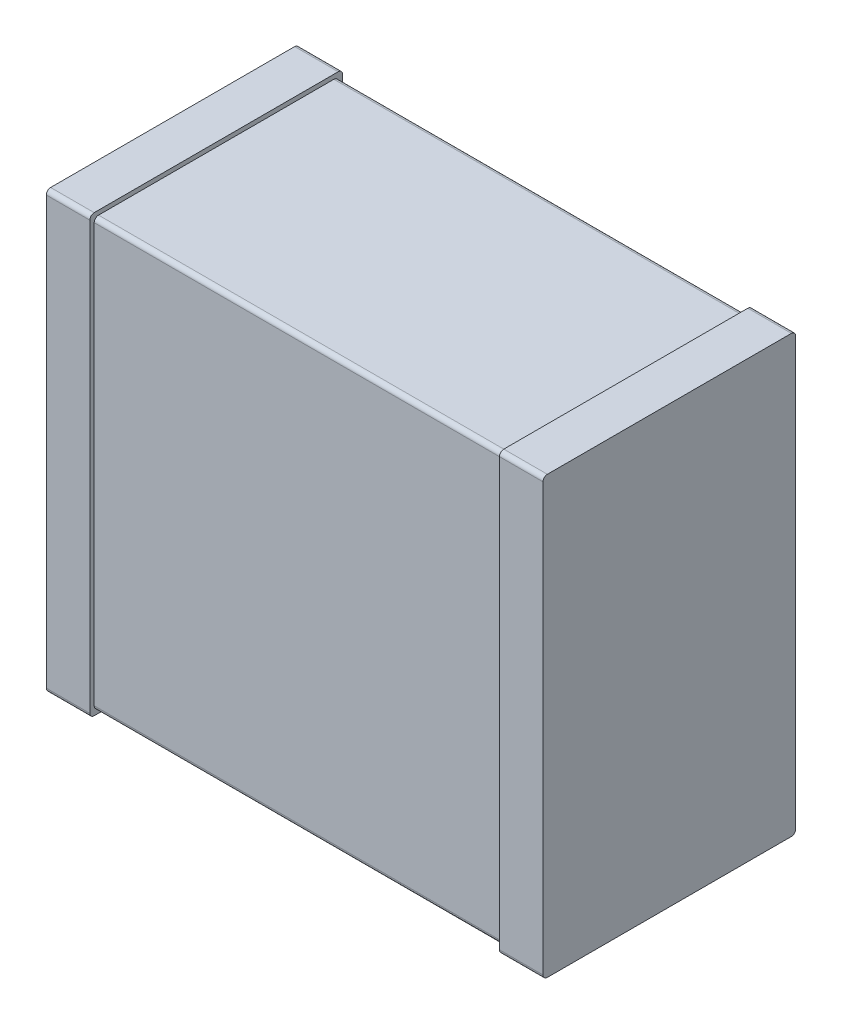
ISO-10303-21;
HEADER;
FILE_DESCRIPTION(('STEP AP214'),'2;1');
FILE_NAME('part.step','',(''),(''),'','','');
FILE_SCHEMA(('AUTOMOTIVE_DESIGN { 1 0 10303 214 1 1 1 1 }'));
ENDSEC;
DATA;
#1=APPLICATION_CONTEXT('core data for automotive mechanical design processes');
#2=APPLICATION_PROTOCOL_DEFINITION('international standard','automotive_design',2000,#1);
#3=PRODUCT_CONTEXT('',#1,'mechanical');
#4=PRODUCT('Part','Part','',(#3));
#5=PRODUCT_RELATED_PRODUCT_CATEGORY('part','',(#4));
#6=PRODUCT_DEFINITION_FORMATION('','',#4);
#7=PRODUCT_DEFINITION_CONTEXT('part definition',#1,'design');
#8=PRODUCT_DEFINITION('design','',#6,#7);
#9=PRODUCT_DEFINITION_SHAPE('','',#8);
#10=(LENGTH_UNIT() NAMED_UNIT(*) SI_UNIT(.MILLI.,.METRE.));
#11=(NAMED_UNIT(*) PLANE_ANGLE_UNIT() SI_UNIT($,.RADIAN.));
#12=(NAMED_UNIT(*) SI_UNIT($,.STERADIAN.) SOLID_ANGLE_UNIT());
#13=UNCERTAINTY_MEASURE_WITH_UNIT(LENGTH_MEASURE(1.E-05),#10,'distance_accuracy_value','');
#14=(GEOMETRIC_REPRESENTATION_CONTEXT(3) GLOBAL_UNCERTAINTY_ASSIGNED_CONTEXT((#13)) GLOBAL_UNIT_ASSIGNED_CONTEXT((#10,
#11,#12)) REPRESENTATION_CONTEXT('',''));
#15=CARTESIAN_POINT('',(0.,0.,0.));
#16=DIRECTION('',(0.,0.,1.));
#17=DIRECTION('',(1.,0.,0.));
#18=AXIS2_PLACEMENT_3D('',#15,#16,#17);
#19=CARTESIAN_POINT('',(-2.85,-2.5,0.));
#20=DIRECTION('',(1.,0.,0.));
#21=DIRECTION('',(0.,1.,0.));
#22=AXIS2_PLACEMENT_3D('',#19,#20,#21);
#23=PLANE('',#22);
#24=CARTESIAN_POINT('',(-2.85,-2.45,2.85));
#25=DIRECTION('',(-1.,0.,0.));
#26=DIRECTION('',(0.,0.,1.));
#27=AXIS2_PLACEMENT_3D('',#24,#25,#26);
#28=CIRCLE('',#27,0.05);
#29=CARTESIAN_POINT('',(-2.85,-2.5,2.85));
#30=VERTEX_POINT('',#29);
#31=CARTESIAN_POINT('',(-2.85,-2.45,2.9));
#32=VERTEX_POINT('',#31);
#33=EDGE_CURVE('E323',#30,#32,#28,.T.);
#34=ORIENTED_EDGE('',*,*,#33,.T.);
#35=DIRECTION('',(0.,1.,0.));
#36=VECTOR('',#35,1.);
#37=CARTESIAN_POINT('',(-2.85,-2.5,2.9));
#38=LINE('',#37,#36);
#39=CARTESIAN_POINT('',(-2.85,2.45,2.9));
#40=VERTEX_POINT('',#39);
#41=EDGE_CURVE('E82',#32,#40,#38,.T.);
#42=ORIENTED_EDGE('',*,*,#41,.T.);
#43=CARTESIAN_POINT('',(-2.85,2.45,2.85));
#44=DIRECTION('',(1.,0.,0.));
#45=DIRECTION('',(0.,0.,1.));
#46=AXIS2_PLACEMENT_3D('',#43,#44,#45);
#47=CIRCLE('',#46,0.05);
#48=CARTESIAN_POINT('',(-2.85,2.5,2.85));
#49=VERTEX_POINT('',#48);
#50=EDGE_CURVE('E240',#49,#40,#47,.T.);
#51=ORIENTED_EDGE('',*,*,#50,.F.);
#52=DIRECTION('',(0.,0.,1.));
#53=VECTOR('',#52,1.);
#54=CARTESIAN_POINT('',(-2.85,2.5,0.));
#55=LINE('',#54,#53);
#56=CARTESIAN_POINT('',(-2.85,2.5,0.05));
#57=VERTEX_POINT('',#56);
#58=EDGE_CURVE('E11',#57,#49,#55,.T.);
#59=ORIENTED_EDGE('',*,*,#58,.F.);
#60=CARTESIAN_POINT('',(-2.85,2.45,0.05));
#61=DIRECTION('',(-1.,0.,0.));
#62=DIRECTION('',(0.,0.,1.));
#63=AXIS2_PLACEMENT_3D('',#60,#61,#62);
#64=CIRCLE('',#63,0.05);
#65=CARTESIAN_POINT('',(-2.85,2.45,0.));
#66=VERTEX_POINT('',#65);
#67=EDGE_CURVE('E335',#57,#66,#64,.T.);
#68=ORIENTED_EDGE('',*,*,#67,.T.);
#69=DIRECTION('',(0.,1.,0.));
#70=VECTOR('',#69,1.);
#71=CARTESIAN_POINT('',(-2.85,-2.5,0.));
#72=LINE('',#71,#70);
#73=CARTESIAN_POINT('',(-2.85,-2.45,0.));
#74=VERTEX_POINT('',#73);
#75=EDGE_CURVE('E71',#74,#66,#72,.T.);
#76=ORIENTED_EDGE('',*,*,#75,.F.);
#77=CARTESIAN_POINT('',(-2.85,-2.45,0.05));
#78=DIRECTION('',(1.,0.,0.));
#79=DIRECTION('',(0.,0.,1.));
#80=AXIS2_PLACEMENT_3D('',#77,#78,#79);
#81=CIRCLE('',#80,0.05);
#82=CARTESIAN_POINT('',(-2.85,-2.5,0.05));
#83=VERTEX_POINT('',#82);
#84=EDGE_CURVE('E313',#83,#74,#81,.T.);
#85=ORIENTED_EDGE('',*,*,#84,.F.);
#86=DIRECTION('',(0.,0.,1.));
#87=VECTOR('',#86,1.);
#88=CARTESIAN_POINT('',(-2.85,-2.5,0.));
#89=LINE('',#88,#87);
#90=EDGE_CURVE('E314',#83,#30,#89,.T.);
#91=ORIENTED_EDGE('',*,*,#90,.T.);
#92=EDGE_LOOP('',(#34,#42,#51,#59,#68,#76,#85,#91));
#93=FACE_BOUND('',#92,.T.);
#94=ADVANCED_FACE('F17',(#93),#23,.F.);
#95=CARTESIAN_POINT('',(-2.85,2.5,0.));
#96=DIRECTION('',(0.,1.,0.));
#97=DIRECTION('',(1.,0.,0.));
#98=AXIS2_PLACEMENT_3D('',#95,#96,#97);
#99=PLANE('',#98);
#100=DIRECTION('',(0.,0.,1.));
#101=VECTOR('',#100,1.);
#102=CARTESIAN_POINT('',(-2.35,2.5,0.));
#103=LINE('',#102,#101);
#104=CARTESIAN_POINT('',(-2.35,2.5,0.05));
#105=VERTEX_POINT('',#104);
#106=CARTESIAN_POINT('',(-2.35,2.5,2.85));
#107=VERTEX_POINT('',#106);
#108=EDGE_CURVE('E258',#105,#107,#103,.T.);
#109=ORIENTED_EDGE('',*,*,#108,.F.);
#110=DIRECTION('',(1.,0.,0.));
#111=VECTOR('',#110,1.);
#112=CARTESIAN_POINT('',(-2.85,2.5,0.05));
#113=LINE('',#112,#111);
#114=EDGE_CURVE('E242',#57,#105,#113,.T.);
#115=ORIENTED_EDGE('',*,*,#114,.F.);
#116=ORIENTED_EDGE('',*,*,#58,.T.);
#117=DIRECTION('',(1.,0.,0.));
#118=VECTOR('',#117,1.);
#119=CARTESIAN_POINT('',(-2.85,2.5,2.85));
#120=LINE('',#119,#118);
#121=EDGE_CURVE('E20',#49,#107,#120,.T.);
#122=ORIENTED_EDGE('',*,*,#121,.T.);
#123=EDGE_LOOP('',(#109,#115,#116,#122));
#124=FACE_BOUND('',#123,.T.);
#125=ADVANCED_FACE('F571',(#124),#99,.T.);
#126=CARTESIAN_POINT('',(-2.85,2.45,2.85));
#127=DIRECTION('',(1.,0.,0.));
#128=DIRECTION('',(0.,1.,0.));
#129=AXIS2_PLACEMENT_3D('',#126,#127,#128);
#130=CYLINDRICAL_SURFACE('',#129,0.05);
#131=ORIENTED_EDGE('',*,*,#50,.T.);
#132=DIRECTION('',(1.,0.,0.));
#133=VECTOR('',#132,1.);
#134=CARTESIAN_POINT('',(-2.85,2.45,2.9));
#135=LINE('',#134,#133);
#136=CARTESIAN_POINT('',(-2.35,2.45,2.9));
#137=VERTEX_POINT('',#136);
#138=EDGE_CURVE('E234',#40,#137,#135,.T.);
#139=ORIENTED_EDGE('',*,*,#138,.T.);
#140=CARTESIAN_POINT('',(-2.35,2.45,2.85));
#141=DIRECTION('',(1.,0.,0.));
#142=DIRECTION('',(0.,0.,1.));
#143=AXIS2_PLACEMENT_3D('',#140,#141,#142);
#144=CIRCLE('',#143,0.05);
#145=EDGE_CURVE('E238',#107,#137,#144,.T.);
#146=ORIENTED_EDGE('',*,*,#145,.F.);
#147=ORIENTED_EDGE('',*,*,#121,.F.);
#148=EDGE_LOOP('',(#131,#139,#146,#147));
#149=FACE_BOUND('',#148,.T.);
#150=ADVANCED_FACE('F236',(#149),#130,.T.);
#151=CARTESIAN_POINT('',(-2.85,2.45,0.05));
#152=DIRECTION('',(1.,0.,0.));
#153=DIRECTION('',(0.,1.,0.));
#154=AXIS2_PLACEMENT_3D('',#151,#152,#153);
#155=CYLINDRICAL_SURFACE('',#154,0.05);
#156=ORIENTED_EDGE('',*,*,#114,.T.);
#157=CARTESIAN_POINT('',(-2.35,2.45,0.05));
#158=DIRECTION('',(-1.,0.,0.));
#159=DIRECTION('',(0.,0.,1.));
#160=AXIS2_PLACEMENT_3D('',#157,#158,#159);
#161=CIRCLE('',#160,0.05);
#162=CARTESIAN_POINT('',(-2.35,2.45,0.));
#163=VERTEX_POINT('',#162);
#164=EDGE_CURVE('E265',#105,#163,#161,.T.);
#165=ORIENTED_EDGE('',*,*,#164,.T.);
#166=DIRECTION('',(1.,0.,0.));
#167=VECTOR('',#166,1.);
#168=CARTESIAN_POINT('',(-2.85,2.45,0.));
#169=LINE('',#168,#167);
#170=EDGE_CURVE('E326',#66,#163,#169,.T.);
#171=ORIENTED_EDGE('',*,*,#170,.F.);
#172=ORIENTED_EDGE('',*,*,#67,.F.);
#173=EDGE_LOOP('',(#156,#165,#171,#172));
#174=FACE_BOUND('',#173,.T.);
#175=ADVANCED_FACE('F555',(#174),#155,.T.);
#176=CARTESIAN_POINT('',(-2.85,-2.5,2.9));
#177=DIRECTION('',(0.,0.,1.));
#178=DIRECTION('',(1.,0.,0.));
#179=AXIS2_PLACEMENT_3D('',#176,#177,#178);
#180=PLANE('',#179);
#181=ORIENTED_EDGE('',*,*,#41,.F.);
#182=DIRECTION('',(1.,0.,0.));
#183=VECTOR('',#182,1.);
#184=CARTESIAN_POINT('',(-2.85,-2.45,2.9));
#185=LINE('',#184,#183);
#186=CARTESIAN_POINT('',(-2.35,-2.45,2.9));
#187=VERTEX_POINT('',#186);
#188=EDGE_CURVE('E248',#32,#187,#185,.T.);
#189=ORIENTED_EDGE('',*,*,#188,.T.);
#190=DIRECTION('',(0.,1.,0.));
#191=VECTOR('',#190,1.);
#192=CARTESIAN_POINT('',(-2.35,-2.5,2.9));
#193=LINE('',#192,#191);
#194=EDGE_CURVE('E245',#187,#137,#193,.T.);
#195=ORIENTED_EDGE('',*,*,#194,.T.);
#196=ORIENTED_EDGE('',*,*,#138,.F.);
#197=EDGE_LOOP('',(#181,#189,#195,#196));
#198=FACE_BOUND('',#197,.T.);
#199=ADVANCED_FACE('F246',(#198),#180,.T.);
#200=CARTESIAN_POINT('',(-2.85,-2.5,0.));
#201=DIRECTION('',(0.,0.,1.));
#202=DIRECTION('',(1.,0.,0.));
#203=AXIS2_PLACEMENT_3D('',#200,#201,#202);
#204=PLANE('',#203);
#205=ORIENTED_EDGE('',*,*,#170,.T.);
#206=DIRECTION('',(0.,1.,0.));
#207=VECTOR('',#206,1.);
#208=CARTESIAN_POINT('',(-2.35,-2.5,0.));
#209=LINE('',#208,#207);
#210=CARTESIAN_POINT('',(-2.35,-2.45,0.));
#211=VERTEX_POINT('',#210);
#212=EDGE_CURVE('E302',#211,#163,#209,.T.);
#213=ORIENTED_EDGE('',*,*,#212,.F.);
#214=DIRECTION('',(1.,0.,0.));
#215=VECTOR('',#214,1.);
#216=CARTESIAN_POINT('',(-2.85,-2.45,0.));
#217=LINE('',#216,#215);
#218=EDGE_CURVE('E318',#74,#211,#217,.T.);
#219=ORIENTED_EDGE('',*,*,#218,.F.);
#220=ORIENTED_EDGE('',*,*,#75,.T.);
#221=EDGE_LOOP('',(#205,#213,#219,#220));
#222=FACE_BOUND('',#221,.T.);
#223=ADVANCED_FACE('F408',(#222),#204,.F.);
#224=CARTESIAN_POINT('',(-2.85,-2.45,2.85));
#225=DIRECTION('',(1.,0.,0.));
#226=DIRECTION('',(0.,-1.,0.));
#227=AXIS2_PLACEMENT_3D('',#224,#225,#226);
#228=CYLINDRICAL_SURFACE('',#227,0.05);
#229=DIRECTION('',(1.,0.,0.));
#230=VECTOR('',#229,1.);
#231=CARTESIAN_POINT('',(-2.85,-2.5,2.85));
#232=LINE('',#231,#230);
#233=CARTESIAN_POINT('',(-2.35,-2.5,2.85));
#234=VERTEX_POINT('',#233);
#235=EDGE_CURVE('E309',#30,#234,#232,.T.);
#236=ORIENTED_EDGE('',*,*,#235,.T.);
#237=CARTESIAN_POINT('',(-2.35,-2.45,2.85));
#238=DIRECTION('',(-1.,0.,0.));
#239=DIRECTION('',(0.,0.,1.));
#240=AXIS2_PLACEMENT_3D('',#237,#238,#239);
#241=CIRCLE('',#240,0.05);
#242=EDGE_CURVE('E253',#234,#187,#241,.T.);
#243=ORIENTED_EDGE('',*,*,#242,.T.);
#244=ORIENTED_EDGE('',*,*,#188,.F.);
#245=ORIENTED_EDGE('',*,*,#33,.F.);
#246=EDGE_LOOP('',(#236,#243,#244,#245));
#247=FACE_BOUND('',#246,.T.);
#248=ADVANCED_FACE('F404',(#247),#228,.T.);
#249=CARTESIAN_POINT('',(-2.85,-2.45,0.05));
#250=DIRECTION('',(1.,0.,0.));
#251=DIRECTION('',(0.,-1.,0.));
#252=AXIS2_PLACEMENT_3D('',#249,#250,#251);
#253=CYLINDRICAL_SURFACE('',#252,0.05);
#254=ORIENTED_EDGE('',*,*,#84,.T.);
#255=ORIENTED_EDGE('',*,*,#218,.T.);
#256=CARTESIAN_POINT('',(-2.35,-2.45,0.05));
#257=DIRECTION('',(1.,0.,0.));
#258=DIRECTION('',(0.,0.,1.));
#259=AXIS2_PLACEMENT_3D('',#256,#257,#258);
#260=CIRCLE('',#259,0.05);
#261=CARTESIAN_POINT('',(-2.35,-2.5,0.05));
#262=VERTEX_POINT('',#261);
#263=EDGE_CURVE('E305',#262,#211,#260,.T.);
#264=ORIENTED_EDGE('',*,*,#263,.F.);
#265=DIRECTION('',(1.,0.,0.));
#266=VECTOR('',#265,1.);
#267=CARTESIAN_POINT('',(-2.85,-2.5,0.05));
#268=LINE('',#267,#266);
#269=EDGE_CURVE('E310',#83,#262,#268,.T.);
#270=ORIENTED_EDGE('',*,*,#269,.F.);
#271=EDGE_LOOP('',(#254,#255,#264,#270));
#272=FACE_BOUND('',#271,.T.);
#273=ADVANCED_FACE('F349',(#272),#253,.T.);
#274=CARTESIAN_POINT('',(-2.85,-2.5,0.));
#275=DIRECTION('',(0.,1.,0.));
#276=DIRECTION('',(1.,0.,0.));
#277=AXIS2_PLACEMENT_3D('',#274,#275,#276);
#278=PLANE('',#277);
#279=ORIENTED_EDGE('',*,*,#235,.F.);
#280=ORIENTED_EDGE('',*,*,#90,.F.);
#281=ORIENTED_EDGE('',*,*,#269,.T.);
#282=DIRECTION('',(0.,0.,1.));
#283=VECTOR('',#282,1.);
#284=CARTESIAN_POINT('',(-2.35,-2.5,0.));
#285=LINE('',#284,#283);
#286=EDGE_CURVE('E299',#262,#234,#285,.T.);
#287=ORIENTED_EDGE('',*,*,#286,.T.);
#288=EDGE_LOOP('',(#279,#280,#281,#287));
#289=FACE_BOUND('',#288,.T.);
#290=ADVANCED_FACE('F344',(#289),#278,.F.);
#291=CARTESIAN_POINT('',(-2.35,-2.5,0.));
#292=DIRECTION('',(1.,0.,0.));
#293=DIRECTION('',(0.,1.,0.));
#294=AXIS2_PLACEMENT_3D('',#291,#292,#293);
#295=PLANE('',#294);
#296=CARTESIAN_POINT('',(-2.35,-2.4,0.1));
#297=DIRECTION('',(1.,0.,0.));
#298=DIRECTION('',(0.,0.,1.));
#299=AXIS2_PLACEMENT_3D('',#296,#297,#298);
#300=CIRCLE('',#299,0.05);
#301=CARTESIAN_POINT('',(-2.35,-2.45,0.1));
#302=VERTEX_POINT('',#301);
#303=CARTESIAN_POINT('',(-2.35,-2.4,0.05));
#304=VERTEX_POINT('',#303);
#305=EDGE_CURVE('E723',#302,#304,#300,.T.);
#306=ORIENTED_EDGE('',*,*,#305,.F.);
#307=DIRECTION('',(0.,0.,1.));
#308=VECTOR('',#307,1.);
#309=CARTESIAN_POINT('',(-2.35,-2.45,0.05));
#310=LINE('',#309,#308);
#311=CARTESIAN_POINT('',(-2.35,-2.45,2.8));
#312=VERTEX_POINT('',#311);
#313=EDGE_CURVE('E296',#302,#312,#310,.T.);
#314=ORIENTED_EDGE('',*,*,#313,.T.);
#315=CARTESIAN_POINT('',(-2.35,-2.4,2.8));
#316=DIRECTION('',(-1.,0.,0.));
#317=DIRECTION('',(0.,0.,1.));
#318=AXIS2_PLACEMENT_3D('',#315,#316,#317);
#319=CIRCLE('',#318,0.05);
#320=CARTESIAN_POINT('',(-2.35,-2.4,2.85));
#321=VERTEX_POINT('',#320);
#322=EDGE_CURVE('E295',#312,#321,#319,.T.);
#323=ORIENTED_EDGE('',*,*,#322,.T.);
#324=DIRECTION('',(0.,1.,0.));
#325=VECTOR('',#324,1.);
#326=CARTESIAN_POINT('',(-2.35,-2.45,2.85));
#327=LINE('',#326,#325);
#328=CARTESIAN_POINT('',(-2.35,2.4,2.85));
#329=VERTEX_POINT('',#328);
#330=EDGE_CURVE('E288',#321,#329,#327,.T.);
#331=ORIENTED_EDGE('',*,*,#330,.T.);
#332=CARTESIAN_POINT('',(-2.35,2.4,2.8));
#333=DIRECTION('',(1.,0.,0.));
#334=DIRECTION('',(0.,0.,1.));
#335=AXIS2_PLACEMENT_3D('',#332,#333,#334);
#336=CIRCLE('',#335,0.05);
#337=CARTESIAN_POINT('',(-2.35,2.45,2.8));
#338=VERTEX_POINT('',#337);
#339=EDGE_CURVE('E281',#338,#329,#336,.T.);
#340=ORIENTED_EDGE('',*,*,#339,.F.);
#341=DIRECTION('',(0.,0.,1.));
#342=VECTOR('',#341,1.);
#343=CARTESIAN_POINT('',(-2.35,2.45,0.05));
#344=LINE('',#343,#342);
#345=CARTESIAN_POINT('',(-2.35,2.45,0.1));
#346=VERTEX_POINT('',#345);
#347=EDGE_CURVE('E273',#346,#338,#344,.T.);
#348=ORIENTED_EDGE('',*,*,#347,.F.);
#349=CARTESIAN_POINT('',(-2.35,2.4,0.1));
#350=DIRECTION('',(-1.,0.,0.));
#351=DIRECTION('',(0.,0.,1.));
#352=AXIS2_PLACEMENT_3D('',#349,#350,#351);
#353=CIRCLE('',#352,0.05);
#354=CARTESIAN_POINT('',(-2.35,2.4,0.05));
#355=VERTEX_POINT('',#354);
#356=EDGE_CURVE('E271',#346,#355,#353,.T.);
#357=ORIENTED_EDGE('',*,*,#356,.T.);
#358=DIRECTION('',(0.,1.,0.));
#359=VECTOR('',#358,1.);
#360=CARTESIAN_POINT('',(-2.35,-2.45,0.05));
#361=LINE('',#360,#359);
#362=EDGE_CURVE('E698',#304,#355,#361,.T.);
#363=ORIENTED_EDGE('',*,*,#362,.F.);
#364=EDGE_LOOP('',(#306,#314,#323,#331,#340,#348,#357,#363));
#365=FACE_BOUND('',#364,.T.);
#366=ORIENTED_EDGE('',*,*,#286,.F.);
#367=ORIENTED_EDGE('',*,*,#263,.T.);
#368=ORIENTED_EDGE('',*,*,#212,.T.);
#369=ORIENTED_EDGE('',*,*,#164,.F.);
#370=ORIENTED_EDGE('',*,*,#108,.T.);
#371=ORIENTED_EDGE('',*,*,#145,.T.);
#372=ORIENTED_EDGE('',*,*,#194,.F.);
#373=ORIENTED_EDGE('',*,*,#242,.F.);
#374=EDGE_LOOP('',(#366,#367,#368,#369,#370,#371,#372,#373));
#375=FACE_BOUND('',#374,.T.);
#376=ADVANCED_FACE('F256',(#365,#375),#295,.T.);
#377=CARTESIAN_POINT('',(2.85,-2.5,0.));
#378=DIRECTION('',(1.,0.,0.));
#379=DIRECTION('',(0.,1.,0.));
#380=AXIS2_PLACEMENT_3D('',#377,#378,#379);
#381=PLANE('',#380);
#382=DIRECTION('',(0.,0.,1.));
#383=VECTOR('',#382,1.);
#384=CARTESIAN_POINT('',(2.85,-2.5,0.));
#385=LINE('',#384,#383);
#386=CARTESIAN_POINT('',(2.85,-2.5,0.05));
#387=VERTEX_POINT('',#386);
#388=CARTESIAN_POINT('',(2.85,-2.5,2.85));
#389=VERTEX_POINT('',#388);
#390=EDGE_CURVE('E677',#387,#389,#385,.T.);
#391=ORIENTED_EDGE('',*,*,#390,.F.);
#392=CARTESIAN_POINT('',(2.85,-2.45,0.05));
#393=DIRECTION('',(1.,0.,0.));
#394=DIRECTION('',(0.,0.,1.));
#395=AXIS2_PLACEMENT_3D('',#392,#393,#394);
#396=CIRCLE('',#395,0.05);
#397=CARTESIAN_POINT('',(2.85,-2.45,0.));
#398=VERTEX_POINT('',#397);
#399=EDGE_CURVE('E685',#387,#398,#396,.T.);
#400=ORIENTED_EDGE('',*,*,#399,.T.);
#401=DIRECTION('',(0.,1.,0.));
#402=VECTOR('',#401,1.);
#403=CARTESIAN_POINT('',(2.85,-2.5,0.));
#404=LINE('',#403,#402);
#405=CARTESIAN_POINT('',(2.85,2.45,0.));
#406=VERTEX_POINT('',#405);
#407=EDGE_CURVE('E607',#398,#406,#404,.T.);
#408=ORIENTED_EDGE('',*,*,#407,.T.);
#409=CARTESIAN_POINT('',(2.85,2.45,0.05));
#410=DIRECTION('',(-1.,0.,0.));
#411=DIRECTION('',(0.,0.,1.));
#412=AXIS2_PLACEMENT_3D('',#409,#410,#411);
#413=CIRCLE('',#412,0.05);
#414=CARTESIAN_POINT('',(2.85,2.5,0.05));
#415=VERTEX_POINT('',#414);
#416=EDGE_CURVE('E604',#415,#406,#413,.T.);
#417=ORIENTED_EDGE('',*,*,#416,.F.);
#418=DIRECTION('',(0.,0.,1.));
#419=VECTOR('',#418,1.);
#420=CARTESIAN_POINT('',(2.85,2.5,0.));
#421=LINE('',#420,#419);
#422=CARTESIAN_POINT('',(2.85,2.5,2.85));
#423=VERTEX_POINT('',#422);
#424=EDGE_CURVE('E720',#415,#423,#421,.T.);
#425=ORIENTED_EDGE('',*,*,#424,.T.);
#426=CARTESIAN_POINT('',(2.85,2.45,2.85));
#427=DIRECTION('',(1.,0.,0.));
#428=DIRECTION('',(0.,0.,1.));
#429=AXIS2_PLACEMENT_3D('',#426,#427,#428);
#430=CIRCLE('',#429,0.05);
#431=CARTESIAN_POINT('',(2.85,2.45,2.9));
#432=VERTEX_POINT('',#431);
#433=EDGE_CURVE('E709',#423,#432,#430,.T.);
#434=ORIENTED_EDGE('',*,*,#433,.T.);
#435=DIRECTION('',(0.,1.,0.));
#436=VECTOR('',#435,1.);
#437=CARTESIAN_POINT('',(2.85,-2.5,2.9));
#438=LINE('',#437,#436);
#439=CARTESIAN_POINT('',(2.85,-2.45,2.9));
#440=VERTEX_POINT('',#439);
#441=EDGE_CURVE('E646',#440,#432,#438,.T.);
#442=ORIENTED_EDGE('',*,*,#441,.F.);
#443=CARTESIAN_POINT('',(2.85,-2.45,2.85));
#444=DIRECTION('',(-1.,0.,0.));
#445=DIRECTION('',(0.,0.,1.));
#446=AXIS2_PLACEMENT_3D('',#443,#444,#445);
#447=CIRCLE('',#446,0.05);
#448=EDGE_CURVE('E689',#389,#440,#447,.T.);
#449=ORIENTED_EDGE('',*,*,#448,.F.);
#450=EDGE_LOOP('',(#391,#400,#408,#417,#425,#434,#442,#449));
#451=FACE_BOUND('',#450,.T.);
#452=ADVANCED_FACE('F490',(#451),#381,.T.);
#453=CARTESIAN_POINT('',(-2.35,-2.45,0.05));
#454=DIRECTION('',(0.,1.,0.));
#455=DIRECTION('',(1.,0.,0.));
#456=AXIS2_PLACEMENT_3D('',#453,#454,#455);
#457=PLANE('',#456);
#458=DIRECTION('',(1.,0.,0.));
#459=VECTOR('',#458,1.);
#460=CARTESIAN_POINT('',(-2.35,-2.45,2.8));
#461=LINE('',#460,#459);
#462=CARTESIAN_POINT('',(2.35,-2.45,2.8));
#463=VERTEX_POINT('',#462);
#464=EDGE_CURVE('E292',#312,#463,#461,.T.);
#465=ORIENTED_EDGE('',*,*,#464,.F.);
#466=ORIENTED_EDGE('',*,*,#313,.F.);
#467=DIRECTION('',(1.,0.,0.));
#468=VECTOR('',#467,1.);
#469=CARTESIAN_POINT('',(-2.35,-2.45,0.1));
#470=LINE('',#469,#468);
#471=CARTESIAN_POINT('',(2.35,-2.45,0.1));
#472=VERTEX_POINT('',#471);
#473=EDGE_CURVE('E730',#302,#472,#470,.T.);
#474=ORIENTED_EDGE('',*,*,#473,.T.);
#475=DIRECTION('',(0.,0.,1.));
#476=VECTOR('',#475,1.);
#477=CARTESIAN_POINT('',(2.35,-2.45,0.05));
#478=LINE('',#477,#476);
#479=EDGE_CURVE('E667',#472,#463,#478,.T.);
#480=ORIENTED_EDGE('',*,*,#479,.T.);
#481=EDGE_LOOP('',(#465,#466,#474,#480));
#482=FACE_BOUND('',#481,.T.);
#483=ADVANCED_FACE('F473',(#482),#457,.F.);
#484=CARTESIAN_POINT('',(-2.35,-2.4,2.8));
#485=DIRECTION('',(1.,0.,0.));
#486=DIRECTION('',(0.,-1.,0.));
#487=AXIS2_PLACEMENT_3D('',#484,#485,#486);
#488=CYLINDRICAL_SURFACE('',#487,0.05);
#489=ORIENTED_EDGE('',*,*,#464,.T.);
#490=CARTESIAN_POINT('',(2.35,-2.4,2.8));
#491=DIRECTION('',(-1.,0.,0.));
#492=DIRECTION('',(0.,0.,1.));
#493=AXIS2_PLACEMENT_3D('',#490,#491,#492);
#494=CIRCLE('',#493,0.05);
#495=CARTESIAN_POINT('',(2.35,-2.4,2.85));
#496=VERTEX_POINT('',#495);
#497=EDGE_CURVE('E651',#463,#496,#494,.T.);
#498=ORIENTED_EDGE('',*,*,#497,.T.);
#499=DIRECTION('',(1.,0.,0.));
#500=VECTOR('',#499,1.);
#501=CARTESIAN_POINT('',(-2.35,-2.4,2.85));
#502=LINE('',#501,#500);
#503=EDGE_CURVE('E291',#321,#496,#502,.T.);
#504=ORIENTED_EDGE('',*,*,#503,.F.);
#505=ORIENTED_EDGE('',*,*,#322,.F.);
#506=EDGE_LOOP('',(#489,#498,#504,#505));
#507=FACE_BOUND('',#506,.T.);
#508=ADVANCED_FACE('F469',(#507),#488,.T.);
#509=CARTESIAN_POINT('',(-2.35,-2.45,2.85));
#510=DIRECTION('',(0.,0.,1.));
#511=DIRECTION('',(1.,0.,0.));
#512=AXIS2_PLACEMENT_3D('',#509,#510,#511);
#513=PLANE('',#512);
#514=ORIENTED_EDGE('',*,*,#330,.F.);
#515=ORIENTED_EDGE('',*,*,#503,.T.);
#516=DIRECTION('',(0.,1.,0.));
#517=VECTOR('',#516,1.);
#518=CARTESIAN_POINT('',(2.35,-2.45,2.85));
#519=LINE('',#518,#517);
#520=CARTESIAN_POINT('',(2.35,2.4,2.85));
#521=VERTEX_POINT('',#520);
#522=EDGE_CURVE('E647',#496,#521,#519,.T.);
#523=ORIENTED_EDGE('',*,*,#522,.T.);
#524=DIRECTION('',(1.,0.,0.));
#525=VECTOR('',#524,1.);
#526=CARTESIAN_POINT('',(-2.35,2.4,2.85));
#527=LINE('',#526,#525);
#528=EDGE_CURVE('E285',#329,#521,#527,.T.);
#529=ORIENTED_EDGE('',*,*,#528,.F.);
#530=EDGE_LOOP('',(#514,#515,#523,#529));
#531=FACE_BOUND('',#530,.T.);
#532=ADVANCED_FACE('F371',(#531),#513,.T.);
#533=CARTESIAN_POINT('',(-2.35,2.4,2.8));
#534=DIRECTION('',(1.,0.,0.));
#535=DIRECTION('',(0.,1.,0.));
#536=AXIS2_PLACEMENT_3D('',#533,#534,#535);
#537=CYLINDRICAL_SURFACE('',#536,0.05);
#538=ORIENTED_EDGE('',*,*,#339,.T.);
#539=ORIENTED_EDGE('',*,*,#528,.T.);
#540=CARTESIAN_POINT('',(2.35,2.4,2.8));
#541=DIRECTION('',(1.,0.,0.));
#542=DIRECTION('',(0.,0.,1.));
#543=AXIS2_PLACEMENT_3D('',#540,#541,#542);
#544=CIRCLE('',#543,0.05);
#545=CARTESIAN_POINT('',(2.35,2.45,2.8));
#546=VERTEX_POINT('',#545);
#547=EDGE_CURVE('E652',#546,#521,#544,.T.);
#548=ORIENTED_EDGE('',*,*,#547,.F.);
#549=DIRECTION('',(1.,0.,0.));
#550=VECTOR('',#549,1.);
#551=CARTESIAN_POINT('',(-2.35,2.45,2.8));
#552=LINE('',#551,#550);
#553=EDGE_CURVE('E278',#338,#546,#552,.T.);
#554=ORIENTED_EDGE('',*,*,#553,.F.);
#555=EDGE_LOOP('',(#538,#539,#548,#554));
#556=FACE_BOUND('',#555,.T.);
#557=ADVANCED_FACE('F366',(#556),#537,.T.);
#558=CARTESIAN_POINT('',(-2.35,2.45,0.05));
#559=DIRECTION('',(0.,1.,0.));
#560=DIRECTION('',(1.,0.,0.));
#561=AXIS2_PLACEMENT_3D('',#558,#559,#560);
#562=PLANE('',#561);
#563=DIRECTION('',(0.,0.,1.));
#564=VECTOR('',#563,1.);
#565=CARTESIAN_POINT('',(2.35,2.45,0.05));
#566=LINE('',#565,#564);
#567=CARTESIAN_POINT('',(2.35,2.45,0.1));
#568=VERTEX_POINT('',#567);
#569=EDGE_CURVE('E660',#568,#546,#566,.T.);
#570=ORIENTED_EDGE('',*,*,#569,.F.);
#571=DIRECTION('',(1.,0.,0.));
#572=VECTOR('',#571,1.);
#573=CARTESIAN_POINT('',(-2.35,2.45,0.1));
#574=LINE('',#573,#572);
#575=EDGE_CURVE('E274',#346,#568,#574,.T.);
#576=ORIENTED_EDGE('',*,*,#575,.F.);
#577=ORIENTED_EDGE('',*,*,#347,.T.);
#578=ORIENTED_EDGE('',*,*,#553,.T.);
#579=EDGE_LOOP('',(#570,#576,#577,#578));
#580=FACE_BOUND('',#579,.T.);
#581=ADVANCED_FACE('F370',(#580),#562,.T.);
#582=CARTESIAN_POINT('',(-2.35,2.4,0.1));
#583=DIRECTION('',(1.,0.,0.));
#584=DIRECTION('',(0.,1.,0.));
#585=AXIS2_PLACEMENT_3D('',#582,#583,#584);
#586=CYLINDRICAL_SURFACE('',#585,0.05);
#587=ORIENTED_EDGE('',*,*,#575,.T.);
#588=CARTESIAN_POINT('',(2.35,2.4,0.1));
#589=DIRECTION('',(-1.,0.,0.));
#590=DIRECTION('',(0.,0.,1.));
#591=AXIS2_PLACEMENT_3D('',#588,#589,#590);
#592=CIRCLE('',#591,0.05);
#593=CARTESIAN_POINT('',(2.35,2.4,0.05));
#594=VERTEX_POINT('',#593);
#595=EDGE_CURVE('E655',#568,#594,#592,.T.);
#596=ORIENTED_EDGE('',*,*,#595,.T.);
#597=DIRECTION('',(1.,0.,0.));
#598=VECTOR('',#597,1.);
#599=CARTESIAN_POINT('',(-2.35,2.4,0.05));
#600=LINE('',#599,#598);
#601=EDGE_CURVE('E269',#355,#594,#600,.T.);
#602=ORIENTED_EDGE('',*,*,#601,.F.);
#603=ORIENTED_EDGE('',*,*,#356,.F.);
#604=EDGE_LOOP('',(#587,#596,#602,#603));
#605=FACE_BOUND('',#604,.T.);
#606=ADVANCED_FACE('F398',(#605),#586,.T.);
#607=CARTESIAN_POINT('',(-2.35,-2.45,0.05));
#608=DIRECTION('',(0.,0.,1.));
#609=DIRECTION('',(1.,0.,0.));
#610=AXIS2_PLACEMENT_3D('',#607,#608,#609);
#611=PLANE('',#610);
#612=ORIENTED_EDGE('',*,*,#601,.T.);
#613=DIRECTION('',(0.,1.,0.));
#614=VECTOR('',#613,1.);
#615=CARTESIAN_POINT('',(2.35,-2.45,0.05));
#616=LINE('',#615,#614);
#617=CARTESIAN_POINT('',(2.35,-2.4,0.05));
#618=VERTEX_POINT('',#617);
#619=EDGE_CURVE('E640',#618,#594,#616,.T.);
#620=ORIENTED_EDGE('',*,*,#619,.F.);
#621=DIRECTION('',(1.,0.,0.));
#622=VECTOR('',#621,1.);
#623=CARTESIAN_POINT('',(-2.35,-2.4,0.05));
#624=LINE('',#623,#622);
#625=EDGE_CURVE('E727',#304,#618,#624,.T.);
#626=ORIENTED_EDGE('',*,*,#625,.F.);
#627=ORIENTED_EDGE('',*,*,#362,.T.);
#628=EDGE_LOOP('',(#612,#620,#626,#627));
#629=FACE_BOUND('',#628,.T.);
#630=ADVANCED_FACE('F428',(#629),#611,.F.);
#631=CARTESIAN_POINT('',(-2.35,-2.4,0.1));
#632=DIRECTION('',(1.,0.,0.));
#633=DIRECTION('',(0.,-1.,0.));
#634=AXIS2_PLACEMENT_3D('',#631,#632,#633);
#635=CYLINDRICAL_SURFACE('',#634,0.05);
#636=ORIENTED_EDGE('',*,*,#305,.T.);
#637=ORIENTED_EDGE('',*,*,#625,.T.);
#638=CARTESIAN_POINT('',(2.35,-2.4,0.1));
#639=DIRECTION('',(1.,0.,0.));
#640=DIRECTION('',(0.,0.,1.));
#641=AXIS2_PLACEMENT_3D('',#638,#639,#640);
#642=CIRCLE('',#641,0.05);
#643=EDGE_CURVE('E673',#472,#618,#642,.T.);
#644=ORIENTED_EDGE('',*,*,#643,.F.);
#645=ORIENTED_EDGE('',*,*,#473,.F.);
#646=EDGE_LOOP('',(#636,#637,#644,#645));
#647=FACE_BOUND('',#646,.T.);
#648=ADVANCED_FACE('F423',(#647),#635,.T.);
#649=CARTESIAN_POINT('',(2.35,2.5,0.));
#650=DIRECTION('',(0.,1.,0.));
#651=DIRECTION('',(1.,0.,0.));
#652=AXIS2_PLACEMENT_3D('',#649,#650,#651);
#653=PLANE('',#652);
#654=ORIENTED_EDGE('',*,*,#424,.F.);
#655=DIRECTION('',(1.,0.,0.));
#656=VECTOR('',#655,1.);
#657=CARTESIAN_POINT('',(2.35,2.5,0.05));
#658=LINE('',#657,#656);
#659=CARTESIAN_POINT('',(2.35,2.5,0.05));
#660=VERTEX_POINT('',#659);
#661=EDGE_CURVE('E645',#660,#415,#658,.T.);
#662=ORIENTED_EDGE('',*,*,#661,.F.);
#663=DIRECTION('',(0.,0.,1.));
#664=VECTOR('',#663,1.);
#665=CARTESIAN_POINT('',(2.35,2.5,0.));
#666=LINE('',#665,#664);
#667=CARTESIAN_POINT('',(2.35,2.5,2.85));
#668=VERTEX_POINT('',#667);
#669=EDGE_CURVE('E623',#660,#668,#666,.T.);
#670=ORIENTED_EDGE('',*,*,#669,.T.);
#671=DIRECTION('',(1.,0.,0.));
#672=VECTOR('',#671,1.);
#673=CARTESIAN_POINT('',(2.35,2.5,2.85));
#674=LINE('',#673,#672);
#675=EDGE_CURVE('E716',#668,#423,#674,.T.);
#676=ORIENTED_EDGE('',*,*,#675,.T.);
#677=EDGE_LOOP('',(#654,#662,#670,#676));
#678=FACE_BOUND('',#677,.T.);
#679=ADVANCED_FACE('F427',(#678),#653,.T.);
#680=CARTESIAN_POINT('',(2.35,2.45,2.85));
#681=DIRECTION('',(1.,0.,0.));
#682=DIRECTION('',(0.,1.,0.));
#683=AXIS2_PLACEMENT_3D('',#680,#681,#682);
#684=CYLINDRICAL_SURFACE('',#683,0.05);
#685=CARTESIAN_POINT('',(2.35,2.45,2.85));
#686=DIRECTION('',(1.,0.,0.));
#687=DIRECTION('',(0.,0.,1.));
#688=AXIS2_PLACEMENT_3D('',#685,#686,#687);
#689=CIRCLE('',#688,0.05);
#690=CARTESIAN_POINT('',(2.35,2.45,2.9));
#691=VERTEX_POINT('',#690);
#692=EDGE_CURVE('E630',#668,#691,#689,.T.);
#693=ORIENTED_EDGE('',*,*,#692,.T.);
#694=DIRECTION('',(1.,0.,0.));
#695=VECTOR('',#694,1.);
#696=CARTESIAN_POINT('',(2.35,2.45,2.9));
#697=LINE('',#696,#695);
#698=EDGE_CURVE('E641',#691,#432,#697,.T.);
#699=ORIENTED_EDGE('',*,*,#698,.T.);
#700=ORIENTED_EDGE('',*,*,#433,.F.);
#701=ORIENTED_EDGE('',*,*,#675,.F.);
#702=EDGE_LOOP('',(#693,#699,#700,#701));
#703=FACE_BOUND('',#702,.T.);
#704=ADVANCED_FACE('F446',(#703),#684,.T.);
#705=CARTESIAN_POINT('',(2.35,2.45,0.05));
#706=DIRECTION('',(1.,0.,0.));
#707=DIRECTION('',(0.,1.,0.));
#708=AXIS2_PLACEMENT_3D('',#705,#706,#707);
#709=CYLINDRICAL_SURFACE('',#708,0.05);
#710=ORIENTED_EDGE('',*,*,#661,.T.);
#711=ORIENTED_EDGE('',*,*,#416,.T.);
#712=DIRECTION('',(1.,0.,0.));
#713=VECTOR('',#712,1.);
#714=CARTESIAN_POINT('',(2.35,2.45,0.));
#715=LINE('',#714,#713);
#716=CARTESIAN_POINT('',(2.35,2.45,0.));
#717=VERTEX_POINT('',#716);
#718=EDGE_CURVE('E597',#717,#406,#715,.T.);
#719=ORIENTED_EDGE('',*,*,#718,.F.);
#720=CARTESIAN_POINT('',(2.35,2.45,0.05));
#721=DIRECTION('',(-1.,0.,0.));
#722=DIRECTION('',(0.,0.,1.));
#723=AXIS2_PLACEMENT_3D('',#720,#721,#722);
#724=CIRCLE('',#723,0.05);
#725=EDGE_CURVE('E601',#660,#717,#724,.T.);
#726=ORIENTED_EDGE('',*,*,#725,.F.);
#727=EDGE_LOOP('',(#710,#711,#719,#726));
#728=FACE_BOUND('',#727,.T.);
#729=ADVANCED_FACE('F455',(#728),#709,.T.);
#730=CARTESIAN_POINT('',(2.35,-2.5,2.9));
#731=DIRECTION('',(0.,0.,1.));
#732=DIRECTION('',(1.,0.,0.));
#733=AXIS2_PLACEMENT_3D('',#730,#731,#732);
#734=PLANE('',#733);
#735=DIRECTION('',(0.,1.,0.));
#736=VECTOR('',#735,1.);
#737=CARTESIAN_POINT('',(2.35,-2.5,2.9));
#738=LINE('',#737,#736);
#739=CARTESIAN_POINT('',(2.35,-2.45,2.9));
#740=VERTEX_POINT('',#739);
#741=EDGE_CURVE('E749',#740,#691,#738,.T.);
#742=ORIENTED_EDGE('',*,*,#741,.F.);
#743=DIRECTION('',(1.,0.,0.));
#744=VECTOR('',#743,1.);
#745=CARTESIAN_POINT('',(2.35,-2.45,2.9));
#746=LINE('',#745,#744);
#747=EDGE_CURVE('E608',#740,#440,#746,.T.);
#748=ORIENTED_EDGE('',*,*,#747,.T.);
#749=ORIENTED_EDGE('',*,*,#441,.T.);
#750=ORIENTED_EDGE('',*,*,#698,.F.);
#751=EDGE_LOOP('',(#742,#748,#749,#750));
#752=FACE_BOUND('',#751,.T.);
#753=ADVANCED_FACE('F437',(#752),#734,.T.);
#754=CARTESIAN_POINT('',(2.35,-2.5,0.));
#755=DIRECTION('',(0.,0.,1.));
#756=DIRECTION('',(1.,0.,0.));
#757=AXIS2_PLACEMENT_3D('',#754,#755,#756);
#758=PLANE('',#757);
#759=ORIENTED_EDGE('',*,*,#718,.T.);
#760=ORIENTED_EDGE('',*,*,#407,.F.);
#761=DIRECTION('',(1.,0.,0.));
#762=VECTOR('',#761,1.);
#763=CARTESIAN_POINT('',(2.35,-2.45,0.));
#764=LINE('',#763,#762);
#765=CARTESIAN_POINT('',(2.35,-2.45,0.));
#766=VERTEX_POINT('',#765);
#767=EDGE_CURVE('E613',#766,#398,#764,.T.);
#768=ORIENTED_EDGE('',*,*,#767,.F.);
#769=DIRECTION('',(0.,1.,0.));
#770=VECTOR('',#769,1.);
#771=CARTESIAN_POINT('',(2.35,-2.5,0.));
#772=LINE('',#771,#770);
#773=EDGE_CURVE('E611',#766,#717,#772,.T.);
#774=ORIENTED_EDGE('',*,*,#773,.T.);
#775=EDGE_LOOP('',(#759,#760,#768,#774));
#776=FACE_BOUND('',#775,.T.);
#777=ADVANCED_FACE('F417',(#776),#758,.F.);
#778=CARTESIAN_POINT('',(2.35,-2.45,2.85));
#779=DIRECTION('',(1.,0.,0.));
#780=DIRECTION('',(0.,-1.,0.));
#781=AXIS2_PLACEMENT_3D('',#778,#779,#780);
#782=CYLINDRICAL_SURFACE('',#781,0.05);
#783=DIRECTION('',(1.,0.,0.));
#784=VECTOR('',#783,1.);
#785=CARTESIAN_POINT('',(2.35,-2.5,2.85));
#786=LINE('',#785,#784);
#787=CARTESIAN_POINT('',(2.35,-2.5,2.85));
#788=VERTEX_POINT('',#787);
#789=EDGE_CURVE('E668',#788,#389,#786,.T.);
#790=ORIENTED_EDGE('',*,*,#789,.T.);
#791=ORIENTED_EDGE('',*,*,#448,.T.);
#792=ORIENTED_EDGE('',*,*,#747,.F.);
#793=CARTESIAN_POINT('',(2.35,-2.45,2.85));
#794=DIRECTION('',(-1.,0.,0.));
#795=DIRECTION('',(0.,0.,1.));
#796=AXIS2_PLACEMENT_3D('',#793,#794,#795);
#797=CIRCLE('',#796,0.05);
#798=EDGE_CURVE('E764',#788,#740,#797,.T.);
#799=ORIENTED_EDGE('',*,*,#798,.F.);
#800=EDGE_LOOP('',(#790,#791,#792,#799));
#801=FACE_BOUND('',#800,.T.);
#802=ADVANCED_FACE('F389',(#801),#782,.T.);
#803=CARTESIAN_POINT('',(2.35,-2.45,0.05));
#804=DIRECTION('',(1.,0.,0.));
#805=DIRECTION('',(0.,-1.,0.));
#806=AXIS2_PLACEMENT_3D('',#803,#804,#805);
#807=CYLINDRICAL_SURFACE('',#806,0.05);
#808=CARTESIAN_POINT('',(2.35,-2.45,0.05));
#809=DIRECTION('',(1.,0.,0.));
#810=DIRECTION('',(0.,0.,1.));
#811=AXIS2_PLACEMENT_3D('',#808,#809,#810);
#812=CIRCLE('',#811,0.05);
#813=CARTESIAN_POINT('',(2.35,-2.5,0.05));
#814=VERTEX_POINT('',#813);
#815=EDGE_CURVE('E618',#814,#766,#812,.T.);
#816=ORIENTED_EDGE('',*,*,#815,.T.);
#817=ORIENTED_EDGE('',*,*,#767,.T.);
#818=ORIENTED_EDGE('',*,*,#399,.F.);
#819=DIRECTION('',(1.,0.,0.));
#820=VECTOR('',#819,1.);
#821=CARTESIAN_POINT('',(2.35,-2.5,0.05));
#822=LINE('',#821,#820);
#823=EDGE_CURVE('E672',#814,#387,#822,.T.);
#824=ORIENTED_EDGE('',*,*,#823,.F.);
#825=EDGE_LOOP('',(#816,#817,#818,#824));
#826=FACE_BOUND('',#825,.T.);
#827=ADVANCED_FACE('F380',(#826),#807,.T.);
#828=CARTESIAN_POINT('',(2.35,-2.5,0.));
#829=DIRECTION('',(0.,1.,0.));
#830=DIRECTION('',(1.,0.,0.));
#831=AXIS2_PLACEMENT_3D('',#828,#829,#830);
#832=PLANE('',#831);
#833=ORIENTED_EDGE('',*,*,#789,.F.);
#834=DIRECTION('',(0.,0.,1.));
#835=VECTOR('',#834,1.);
#836=CARTESIAN_POINT('',(2.35,-2.5,0.));
#837=LINE('',#836,#835);
#838=EDGE_CURVE('E636',#814,#788,#837,.T.);
#839=ORIENTED_EDGE('',*,*,#838,.F.);
#840=ORIENTED_EDGE('',*,*,#823,.T.);
#841=ORIENTED_EDGE('',*,*,#390,.T.);
#842=EDGE_LOOP('',(#833,#839,#840,#841));
#843=FACE_BOUND('',#842,.T.);
#844=ADVANCED_FACE('F360',(#843),#832,.F.);
#845=CARTESIAN_POINT('',(2.35,-2.5,0.));
#846=DIRECTION('',(1.,0.,0.));
#847=DIRECTION('',(0.,1.,0.));
#848=AXIS2_PLACEMENT_3D('',#845,#846,#847);
#849=PLANE('',#848);
#850=ORIENTED_EDGE('',*,*,#619,.T.);
#851=ORIENTED_EDGE('',*,*,#595,.F.);
#852=ORIENTED_EDGE('',*,*,#569,.T.);
#853=ORIENTED_EDGE('',*,*,#547,.T.);
#854=ORIENTED_EDGE('',*,*,#522,.F.);
#855=ORIENTED_EDGE('',*,*,#497,.F.);
#856=ORIENTED_EDGE('',*,*,#479,.F.);
#857=ORIENTED_EDGE('',*,*,#643,.T.);
#858=EDGE_LOOP('',(#850,#851,#852,#853,#854,#855,#856,#857));
#859=FACE_BOUND('',#858,.T.);
#860=ORIENTED_EDGE('',*,*,#798,.T.);
#861=ORIENTED_EDGE('',*,*,#741,.T.);
#862=ORIENTED_EDGE('',*,*,#692,.F.);
#863=ORIENTED_EDGE('',*,*,#669,.F.);
#864=ORIENTED_EDGE('',*,*,#725,.T.);
#865=ORIENTED_EDGE('',*,*,#773,.F.);
#866=ORIENTED_EDGE('',*,*,#815,.F.);
#867=ORIENTED_EDGE('',*,*,#838,.T.);
#868=EDGE_LOOP('',(#860,#861,#862,#863,#864,#865,#866,#867));
#869=FACE_BOUND('',#868,.T.);
#870=ADVANCED_FACE('F356',(#859,#869),#849,.F.);
#871=CLOSED_SHELL('',(#94,#125,#150,#175,#199,#223,#248,#273,#290,#376,#452,#483,#508,#532,#557,
#581,#606,#630,#648,#679,#704,#729,#753,#777,#802,#827,#844,#870));
#872=MANIFOLD_SOLID_BREP('B1',#871);
#873=ADVANCED_BREP_SHAPE_REPRESENTATION('',(#18,#872),#14);
#874=SHAPE_DEFINITION_REPRESENTATION(#9,#873);
ENDSEC;
END-ISO-10303-21;
